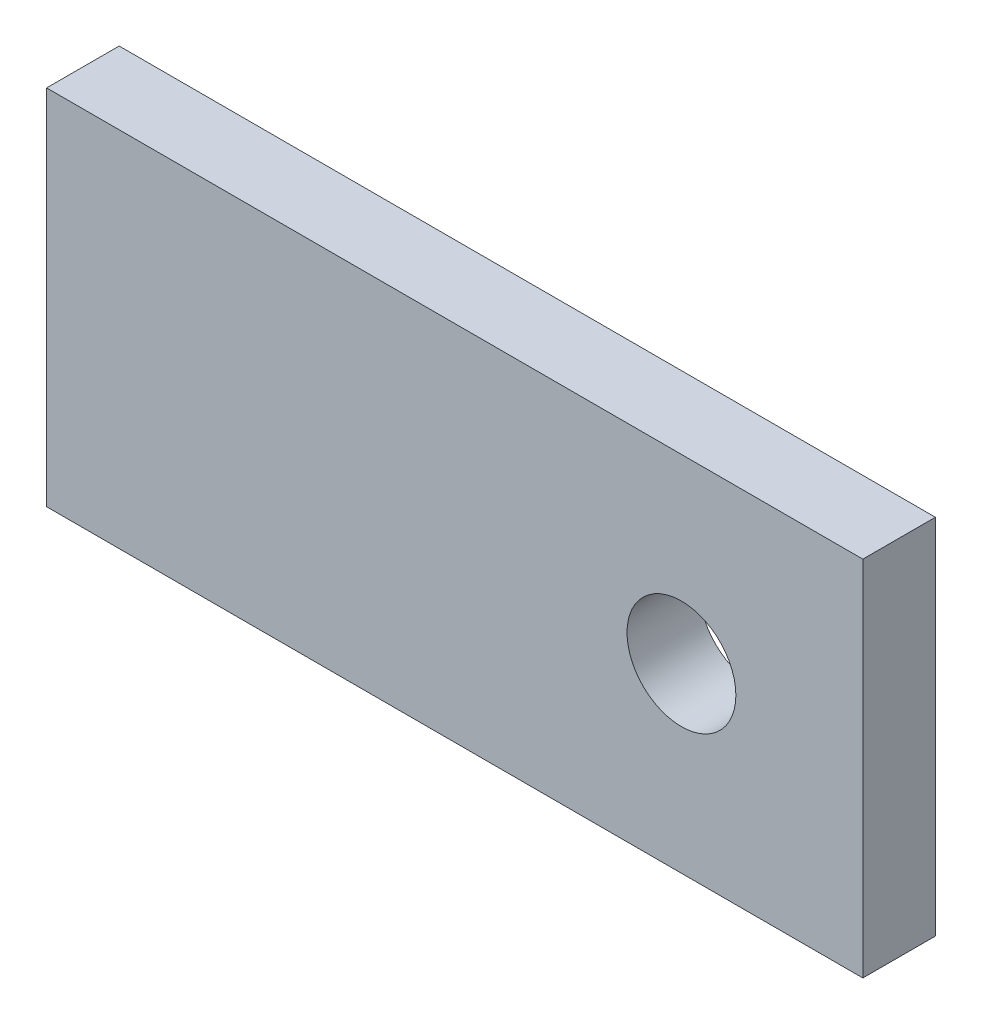
ISO-10303-21;
HEADER;
FILE_DESCRIPTION(('STEP AP214'),'2;1');
FILE_NAME('part.step','',(''),(''),'','','');
FILE_SCHEMA(('AUTOMOTIVE_DESIGN { 1 0 10303 214 1 1 1 1 }'));
ENDSEC;
DATA;
#1=APPLICATION_CONTEXT('core data for automotive mechanical design processes');
#2=APPLICATION_PROTOCOL_DEFINITION('international standard','automotive_design',2000,#1);
#3=PRODUCT_CONTEXT('',#1,'mechanical');
#4=PRODUCT('Part','Part','',(#3));
#5=PRODUCT_RELATED_PRODUCT_CATEGORY('part','',(#4));
#6=PRODUCT_DEFINITION_FORMATION('','',#4);
#7=PRODUCT_DEFINITION_CONTEXT('part definition',#1,'design');
#8=PRODUCT_DEFINITION('design','',#6,#7);
#9=PRODUCT_DEFINITION_SHAPE('','',#8);
#10=(LENGTH_UNIT() NAMED_UNIT(*) SI_UNIT(.MILLI.,.METRE.));
#11=(NAMED_UNIT(*) PLANE_ANGLE_UNIT() SI_UNIT($,.RADIAN.));
#12=(NAMED_UNIT(*) SI_UNIT($,.STERADIAN.) SOLID_ANGLE_UNIT());
#13=UNCERTAINTY_MEASURE_WITH_UNIT(LENGTH_MEASURE(1.E-05),#10,'distance_accuracy_value','');
#14=(GEOMETRIC_REPRESENTATION_CONTEXT(3) GLOBAL_UNCERTAINTY_ASSIGNED_CONTEXT((#13)) GLOBAL_UNIT_ASSIGNED_CONTEXT((#10,
#11,#12)) REPRESENTATION_CONTEXT('',''));
#15=CARTESIAN_POINT('',(0.,0.,0.));
#16=DIRECTION('',(0.,0.,1.));
#17=DIRECTION('',(1.,0.,0.));
#18=AXIS2_PLACEMENT_3D('',#15,#16,#17);
#19=CARTESIAN_POINT('',(0.,0.,8.));
#20=DIRECTION('',(0.,0.,-1.));
#21=DIRECTION('',(-1.,0.,0.));
#22=AXIS2_PLACEMENT_3D('',#19,#20,#21);
#23=PLANE('',#22);
#24=DIRECTION('',(0.,1.,0.));
#25=VECTOR('',#24,1.);
#26=CARTESIAN_POINT('',(40.4081632653061,11.9387755102041,8.));
#27=LINE('',#26,#25);
#28=CARTESIAN_POINT('',(40.4081632653061,-28.0612244897959,8.));
#29=VERTEX_POINT('',#28);
#30=CARTESIAN_POINT('',(40.4081632653061,11.9387755102041,8.));
#31=VERTEX_POINT('',#30);
#32=EDGE_CURVE('E84',#29,#31,#27,.T.);
#33=ORIENTED_EDGE('',*,*,#32,.T.);
#34=DIRECTION('',(-1.,0.,0.));
#35=VECTOR('',#34,1.);
#36=CARTESIAN_POINT('',(40.4081632653061,11.9387755102041,8.));
#37=LINE('',#36,#35);
#38=CARTESIAN_POINT('',(-49.5918367346939,11.9387755102041,8.));
#39=VERTEX_POINT('',#38);
#40=EDGE_CURVE('E79',#31,#39,#37,.T.);
#41=ORIENTED_EDGE('',*,*,#40,.T.);
#42=DIRECTION('',(0.,-1.,0.));
#43=VECTOR('',#42,1.);
#44=CARTESIAN_POINT('',(-49.5918367346939,11.9387755102041,8.));
#45=LINE('',#44,#43);
#46=CARTESIAN_POINT('',(-49.5918367346938,-28.0612244897959,8.));
#47=VERTEX_POINT('',#46);
#48=EDGE_CURVE('E82',#39,#47,#45,.T.);
#49=ORIENTED_EDGE('',*,*,#48,.T.);
#50=DIRECTION('',(1.,0.,0.));
#51=VECTOR('',#50,1.);
#52=CARTESIAN_POINT('',(40.4081632653061,-28.0612244897959,8.));
#53=LINE('',#52,#51);
#54=EDGE_CURVE('E49',#47,#29,#53,.T.);
#55=ORIENTED_EDGE('',*,*,#54,.T.);
#56=EDGE_LOOP('',(#33,#41,#49,#55));
#57=FACE_BOUND('',#56,.T.);
#58=CARTESIAN_POINT('',(20.4081632653061,-8.06122448979591,8.));
#59=DIRECTION('',(0.,0.,1.));
#60=DIRECTION('',(1.,0.,0.));
#61=AXIS2_PLACEMENT_3D('',#58,#59,#60);
#62=CIRCLE('',#61,6.);
#63=CARTESIAN_POINT('',(26.4081632653061,-8.06122448979591,8.));
#64=VERTEX_POINT('',#63);
#65=EDGE_CURVE('E99',#64,#64,#62,.T.);
#66=ORIENTED_EDGE('',*,*,#65,.F.);
#67=EDGE_LOOP('',(#66));
#68=FACE_BOUND('',#67,.T.);
#69=ADVANCED_FACE('F32',(#57,#68),#23,.F.);
#70=CARTESIAN_POINT('',(0.,0.,0.));
#71=DIRECTION('',(0.,0.,-1.));
#72=DIRECTION('',(-1.,0.,0.));
#73=AXIS2_PLACEMENT_3D('',#70,#71,#72);
#74=PLANE('',#73);
#75=DIRECTION('',(0.,1.,0.));
#76=VECTOR('',#75,1.);
#77=CARTESIAN_POINT('',(40.4081632653061,11.9387755102041,0.));
#78=LINE('',#77,#76);
#79=CARTESIAN_POINT('',(40.4081632653061,-28.0612244897959,0.));
#80=VERTEX_POINT('',#79);
#81=CARTESIAN_POINT('',(40.4081632653061,11.9387755102041,0.));
#82=VERTEX_POINT('',#81);
#83=EDGE_CURVE('E96',#80,#82,#78,.T.);
#84=ORIENTED_EDGE('',*,*,#83,.F.);
#85=DIRECTION('',(1.,0.,0.));
#86=VECTOR('',#85,1.);
#87=CARTESIAN_POINT('',(40.4081632653061,-28.0612244897959,0.));
#88=LINE('',#87,#86);
#89=CARTESIAN_POINT('',(-49.5918367346938,-28.0612244897959,0.));
#90=VERTEX_POINT('',#89);
#91=EDGE_CURVE('E72',#90,#80,#88,.T.);
#92=ORIENTED_EDGE('',*,*,#91,.F.);
#93=DIRECTION('',(0.,-1.,0.));
#94=VECTOR('',#93,1.);
#95=CARTESIAN_POINT('',(-49.5918367346939,11.9387755102041,0.));
#96=LINE('',#95,#94);
#97=CARTESIAN_POINT('',(-49.5918367346939,11.9387755102041,0.));
#98=VERTEX_POINT('',#97);
#99=EDGE_CURVE('E66',#98,#90,#96,.T.);
#100=ORIENTED_EDGE('',*,*,#99,.F.);
#101=DIRECTION('',(-1.,0.,0.));
#102=VECTOR('',#101,1.);
#103=CARTESIAN_POINT('',(40.4081632653061,11.9387755102041,0.));
#104=LINE('',#103,#102);
#105=EDGE_CURVE('E88',#82,#98,#104,.T.);
#106=ORIENTED_EDGE('',*,*,#105,.F.);
#107=EDGE_LOOP('',(#84,#92,#100,#106));
#108=FACE_BOUND('',#107,.T.);
#109=CARTESIAN_POINT('',(20.4081632653061,-8.06122448979591,0.));
#110=DIRECTION('',(0.,0.,1.));
#111=DIRECTION('',(1.,0.,0.));
#112=AXIS2_PLACEMENT_3D('',#109,#110,#111);
#113=CIRCLE('',#112,6.);
#114=CARTESIAN_POINT('',(26.4081632653061,-8.06122448979591,0.));
#115=VERTEX_POINT('',#114);
#116=EDGE_CURVE('E111',#115,#115,#113,.T.);
#117=ORIENTED_EDGE('',*,*,#116,.T.);
#118=EDGE_LOOP('',(#117));
#119=FACE_BOUND('',#118,.T.);
#120=ADVANCED_FACE('F107',(#108,#119),#74,.T.);
#121=CARTESIAN_POINT('',(40.4081632653061,11.9387755102041,8.));
#122=DIRECTION('',(-1.,0.,0.));
#123=DIRECTION('',(0.,-1.,0.));
#124=AXIS2_PLACEMENT_3D('',#121,#122,#123);
#125=PLANE('',#124);
#126=ORIENTED_EDGE('',*,*,#83,.T.);
#127=DIRECTION('',(0.,0.,-1.));
#128=VECTOR('',#127,1.);
#129=CARTESIAN_POINT('',(40.4081632653061,11.9387755102041,8.));
#130=LINE('',#129,#128);
#131=EDGE_CURVE('E11',#31,#82,#130,.T.);
#132=ORIENTED_EDGE('',*,*,#131,.F.);
#133=ORIENTED_EDGE('',*,*,#32,.F.);
#134=DIRECTION('',(0.,0.,-1.));
#135=VECTOR('',#134,1.);
#136=CARTESIAN_POINT('',(40.4081632653061,-28.0612244897959,8.));
#137=LINE('',#136,#135);
#138=EDGE_CURVE('E92',#29,#80,#137,.T.);
#139=ORIENTED_EDGE('',*,*,#138,.T.);
#140=EDGE_LOOP('',(#126,#132,#133,#139));
#141=FACE_BOUND('',#140,.T.);
#142=ADVANCED_FACE('F34',(#141),#125,.F.);
#143=CARTESIAN_POINT('',(40.4081632653061,11.9387755102041,8.));
#144=DIRECTION('',(0.,-1.,0.));
#145=DIRECTION('',(1.,0.,0.));
#146=AXIS2_PLACEMENT_3D('',#143,#144,#145);
#147=PLANE('',#146);
#148=ORIENTED_EDGE('',*,*,#105,.T.);
#149=DIRECTION('',(0.,0.,-1.));
#150=VECTOR('',#149,1.);
#151=CARTESIAN_POINT('',(-49.5918367346939,11.9387755102041,8.));
#152=LINE('',#151,#150);
#153=EDGE_CURVE('E41',#39,#98,#152,.T.);
#154=ORIENTED_EDGE('',*,*,#153,.F.);
#155=ORIENTED_EDGE('',*,*,#40,.F.);
#156=ORIENTED_EDGE('',*,*,#131,.T.);
#157=EDGE_LOOP('',(#148,#154,#155,#156));
#158=FACE_BOUND('',#157,.T.);
#159=ADVANCED_FACE('F87',(#158),#147,.F.);
#160=CARTESIAN_POINT('',(-49.5918367346939,11.9387755102041,8.));
#161=DIRECTION('',(1.,0.,0.));
#162=DIRECTION('',(0.,1.,0.));
#163=AXIS2_PLACEMENT_3D('',#160,#161,#162);
#164=PLANE('',#163);
#165=ORIENTED_EDGE('',*,*,#99,.T.);
#166=DIRECTION('',(0.,0.,-1.));
#167=VECTOR('',#166,1.);
#168=CARTESIAN_POINT('',(-49.5918367346938,-28.0612244897959,8.));
#169=LINE('',#168,#167);
#170=EDGE_CURVE('E89',#47,#90,#169,.T.);
#171=ORIENTED_EDGE('',*,*,#170,.F.);
#172=ORIENTED_EDGE('',*,*,#48,.F.);
#173=ORIENTED_EDGE('',*,*,#153,.T.);
#174=EDGE_LOOP('',(#165,#171,#172,#173));
#175=FACE_BOUND('',#174,.T.);
#176=ADVANCED_FACE('F90',(#175),#164,.F.);
#177=CARTESIAN_POINT('',(40.4081632653061,-28.0612244897959,8.));
#178=DIRECTION('',(0.,1.,0.));
#179=DIRECTION('',(-1.,0.,0.));
#180=AXIS2_PLACEMENT_3D('',#177,#178,#179);
#181=PLANE('',#180);
#182=ORIENTED_EDGE('',*,*,#91,.T.);
#183=ORIENTED_EDGE('',*,*,#138,.F.);
#184=ORIENTED_EDGE('',*,*,#54,.F.);
#185=ORIENTED_EDGE('',*,*,#170,.T.);
#186=EDGE_LOOP('',(#182,#183,#184,#185));
#187=FACE_BOUND('',#186,.T.);
#188=ADVANCED_FACE('F104',(#187),#181,.F.);
#189=CARTESIAN_POINT('',(20.4081632653061,-8.06122448979591,8.));
#190=DIRECTION('',(0.,0.,-1.));
#191=DIRECTION('',(-1.,0.,0.));
#192=AXIS2_PLACEMENT_3D('',#189,#190,#191);
#193=CYLINDRICAL_SURFACE('',#192,6.);
#194=ORIENTED_EDGE('',*,*,#65,.T.);
#195=EDGE_LOOP('',(#194));
#196=FACE_BOUND('',#195,.T.);
#197=ORIENTED_EDGE('',*,*,#116,.F.);
#198=EDGE_LOOP('',(#197));
#199=FACE_BOUND('',#198,.T.);
#200=ADVANCED_FACE('F117',(#196,#199),#193,.F.);
#201=CLOSED_SHELL('',(#69,#120,#142,#159,#176,#188,#200));
#202=MANIFOLD_SOLID_BREP('B2',#201);
#203=ADVANCED_BREP_SHAPE_REPRESENTATION('',(#18,#202),#14);
#204=SHAPE_DEFINITION_REPRESENTATION(#9,#203);
ENDSEC;
END-ISO-10303-21;
